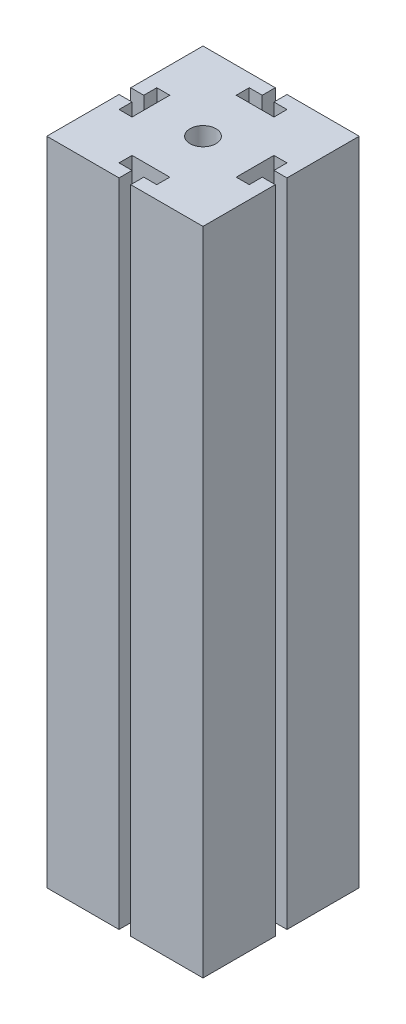
ISO-10303-21;
HEADER;
FILE_DESCRIPTION(('STEP AP214'),'2;1');
FILE_NAME('part.step','',(''),(''),'','','');
FILE_SCHEMA(('AUTOMOTIVE_DESIGN { 1 0 10303 214 1 1 1 1 }'));
ENDSEC;
DATA;
#1=APPLICATION_CONTEXT('core data for automotive mechanical design processes');
#2=APPLICATION_PROTOCOL_DEFINITION('international standard','automotive_design',2000,#1);
#3=PRODUCT_CONTEXT('',#1,'mechanical');
#4=PRODUCT('Part','Part','',(#3));
#5=PRODUCT_RELATED_PRODUCT_CATEGORY('part','',(#4));
#6=PRODUCT_DEFINITION_FORMATION('','',#4);
#7=PRODUCT_DEFINITION_CONTEXT('part definition',#1,'design');
#8=PRODUCT_DEFINITION('design','',#6,#7);
#9=PRODUCT_DEFINITION_SHAPE('','',#8);
#10=(LENGTH_UNIT() NAMED_UNIT(*) SI_UNIT(.MILLI.,.METRE.));
#11=(NAMED_UNIT(*) PLANE_ANGLE_UNIT() SI_UNIT($,.RADIAN.));
#12=(NAMED_UNIT(*) SI_UNIT($,.STERADIAN.) SOLID_ANGLE_UNIT());
#13=UNCERTAINTY_MEASURE_WITH_UNIT(LENGTH_MEASURE(1.E-05),#10,'distance_accuracy_value','');
#14=(GEOMETRIC_REPRESENTATION_CONTEXT(3) GLOBAL_UNCERTAINTY_ASSIGNED_CONTEXT((#13)) GLOBAL_UNIT_ASSIGNED_CONTEXT((#10,
#11,#12)) REPRESENTATION_CONTEXT('',''));
#15=CARTESIAN_POINT('',(0.,0.,0.));
#16=DIRECTION('',(0.,0.,1.));
#17=DIRECTION('',(1.,0.,0.));
#18=AXIS2_PLACEMENT_3D('',#15,#16,#17);
#19=CARTESIAN_POINT('',(-6.,50.,-6.));
#20=DIRECTION('',(1.,0.,0.));
#21=DIRECTION('',(0.,0.,-1.));
#22=AXIS2_PLACEMENT_3D('',#19,#20,#21);
#23=PLANE('',#22);
#24=DIRECTION('',(0.,0.,1.));
#25=VECTOR('',#24,1.);
#26=CARTESIAN_POINT('',(-6.,0.,-6.));
#27=LINE('',#26,#25);
#28=CARTESIAN_POINT('',(-6.,0.,-6.));
#29=VERTEX_POINT('',#28);
#30=CARTESIAN_POINT('',(-6.,0.,-0.45));
#31=VERTEX_POINT('',#30);
#32=EDGE_CURVE('E289',#29,#31,#27,.T.);
#33=ORIENTED_EDGE('',*,*,#32,.T.);
#34=DIRECTION('',(0.,1.,0.));
#35=VECTOR('',#34,1.);
#36=CARTESIAN_POINT('',(-6.,0.,-0.45));
#37=LINE('',#36,#35);
#38=CARTESIAN_POINT('',(-6.,50.,-0.45));
#39=VERTEX_POINT('',#38);
#40=EDGE_CURVE('E290',#31,#39,#37,.T.);
#41=ORIENTED_EDGE('',*,*,#40,.T.);
#42=DIRECTION('',(0.,0.,1.));
#43=VECTOR('',#42,1.);
#44=CARTESIAN_POINT('',(-6.,50.,-6.));
#45=LINE('',#44,#43);
#46=CARTESIAN_POINT('',(-6.,50.,-6.));
#47=VERTEX_POINT('',#46);
#48=EDGE_CURVE('E450',#47,#39,#45,.T.);
#49=ORIENTED_EDGE('',*,*,#48,.F.);
#50=DIRECTION('',(0.,-1.,0.));
#51=VECTOR('',#50,1.);
#52=CARTESIAN_POINT('',(-6.,50.,-6.));
#53=LINE('',#52,#51);
#54=EDGE_CURVE('E310',#47,#29,#53,.T.);
#55=ORIENTED_EDGE('',*,*,#54,.T.);
#56=EDGE_LOOP('',(#33,#41,#49,#55));
#57=FACE_BOUND('',#56,.T.);
#58=ADVANCED_FACE('F33',(#57),#23,.F.);
#59=CARTESIAN_POINT('',(-6.,50.,6.));
#60=DIRECTION('',(0.,0.,-1.));
#61=DIRECTION('',(-1.,0.,0.));
#62=AXIS2_PLACEMENT_3D('',#59,#60,#61);
#63=PLANE('',#62);
#64=DIRECTION('',(1.,0.,0.));
#65=VECTOR('',#64,1.);
#66=CARTESIAN_POINT('',(-6.,0.,6.));
#67=LINE('',#66,#65);
#68=CARTESIAN_POINT('',(-6.,0.,6.));
#69=VERTEX_POINT('',#68);
#70=CARTESIAN_POINT('',(-0.449999999999921,0.,5.99999999999997));
#71=VERTEX_POINT('',#70);
#72=EDGE_CURVE('E288',#69,#71,#67,.T.);
#73=ORIENTED_EDGE('',*,*,#72,.T.);
#74=DIRECTION('',(0.,1.,0.));
#75=VECTOR('',#74,1.);
#76=CARTESIAN_POINT('',(-0.449999999999921,0.,5.99999999999997));
#77=LINE('',#76,#75);
#78=CARTESIAN_POINT('',(-0.449999999999921,50.,5.99999999999997));
#79=VERTEX_POINT('',#78);
#80=EDGE_CURVE('E414',#71,#79,#77,.T.);
#81=ORIENTED_EDGE('',*,*,#80,.T.);
#82=DIRECTION('',(1.,0.,0.));
#83=VECTOR('',#82,1.);
#84=CARTESIAN_POINT('',(-6.,50.,6.));
#85=LINE('',#84,#83);
#86=CARTESIAN_POINT('',(-6.,50.,6.));
#87=VERTEX_POINT('',#86);
#88=EDGE_CURVE('E454',#87,#79,#85,.T.);
#89=ORIENTED_EDGE('',*,*,#88,.F.);
#90=DIRECTION('',(0.,-1.,0.));
#91=VECTOR('',#90,1.);
#92=CARTESIAN_POINT('',(-6.,50.,6.));
#93=LINE('',#92,#91);
#94=EDGE_CURVE('E11',#87,#69,#93,.T.);
#95=ORIENTED_EDGE('',*,*,#94,.T.);
#96=EDGE_LOOP('',(#73,#81,#89,#95));
#97=FACE_BOUND('',#96,.T.);
#98=ADVANCED_FACE('F624',(#97),#63,.F.);
#99=CARTESIAN_POINT('',(6.,50.,-6.));
#100=DIRECTION('',(-1.,0.,0.));
#101=DIRECTION('',(0.,0.,1.));
#102=AXIS2_PLACEMENT_3D('',#99,#100,#101);
#103=PLANE('',#102);
#104=DIRECTION('',(0.,0.,-1.));
#105=VECTOR('',#104,1.);
#106=CARTESIAN_POINT('',(6.,0.,-6.));
#107=LINE('',#106,#105);
#108=CARTESIAN_POINT('',(6.,0.,6.));
#109=VERTEX_POINT('',#108);
#110=CARTESIAN_POINT('',(6.00000000000004,0.,0.449999999999885));
#111=VERTEX_POINT('',#110);
#112=EDGE_CURVE('E303',#109,#111,#107,.T.);
#113=ORIENTED_EDGE('',*,*,#112,.T.);
#114=DIRECTION('',(0.,1.,0.));
#115=VECTOR('',#114,1.);
#116=CARTESIAN_POINT('',(6.00000000000004,0.,0.449999999999885));
#117=LINE('',#116,#115);
#118=CARTESIAN_POINT('',(6.00000000000004,50.,0.449999999999885));
#119=VERTEX_POINT('',#118);
#120=EDGE_CURVE('E360',#111,#119,#117,.T.);
#121=ORIENTED_EDGE('',*,*,#120,.T.);
#122=DIRECTION('',(0.,0.,-1.));
#123=VECTOR('',#122,1.);
#124=CARTESIAN_POINT('',(6.,50.,-6.));
#125=LINE('',#124,#123);
#126=CARTESIAN_POINT('',(6.,50.,6.));
#127=VERTEX_POINT('',#126);
#128=EDGE_CURVE('E323',#127,#119,#125,.T.);
#129=ORIENTED_EDGE('',*,*,#128,.F.);
#130=DIRECTION('',(0.,-1.,0.));
#131=VECTOR('',#130,1.);
#132=CARTESIAN_POINT('',(6.,50.,6.));
#133=LINE('',#132,#131);
#134=EDGE_CURVE('E41',#127,#109,#133,.T.);
#135=ORIENTED_EDGE('',*,*,#134,.T.);
#136=EDGE_LOOP('',(#113,#121,#129,#135));
#137=FACE_BOUND('',#136,.T.);
#138=ADVANCED_FACE('F320',(#137),#103,.F.);
#139=CARTESIAN_POINT('',(-6.,50.,-6.));
#140=DIRECTION('',(0.,0.,1.));
#141=DIRECTION('',(1.,0.,0.));
#142=AXIS2_PLACEMENT_3D('',#139,#140,#141);
#143=PLANE('',#142);
#144=DIRECTION('',(-1.,0.,0.));
#145=VECTOR('',#144,1.);
#146=CARTESIAN_POINT('',(-6.,0.,-6.));
#147=LINE('',#146,#145);
#148=CARTESIAN_POINT('',(6.,0.,-6.));
#149=VERTEX_POINT('',#148);
#150=CARTESIAN_POINT('',(0.450000000000021,0.,-6.));
#151=VERTEX_POINT('',#150);
#152=EDGE_CURVE('E307',#149,#151,#147,.T.);
#153=ORIENTED_EDGE('',*,*,#152,.T.);
#154=DIRECTION('',(0.,1.,0.));
#155=VECTOR('',#154,1.);
#156=CARTESIAN_POINT('',(0.450000000000021,0.,-6.));
#157=LINE('',#156,#155);
#158=CARTESIAN_POINT('',(0.450000000000021,50.,-6.));
#159=VERTEX_POINT('',#158);
#160=EDGE_CURVE('E346',#151,#159,#157,.T.);
#161=ORIENTED_EDGE('',*,*,#160,.T.);
#162=DIRECTION('',(-1.,0.,0.));
#163=VECTOR('',#162,1.);
#164=CARTESIAN_POINT('',(-6.,50.,-6.));
#165=LINE('',#164,#163);
#166=CARTESIAN_POINT('',(6.,50.,-6.));
#167=VERTEX_POINT('',#166);
#168=EDGE_CURVE('E299',#167,#159,#165,.T.);
#169=ORIENTED_EDGE('',*,*,#168,.F.);
#170=DIRECTION('',(0.,-1.,0.));
#171=VECTOR('',#170,1.);
#172=CARTESIAN_POINT('',(6.,50.,-6.));
#173=LINE('',#172,#171);
#174=EDGE_CURVE('E313',#167,#149,#173,.T.);
#175=ORIENTED_EDGE('',*,*,#174,.T.);
#176=EDGE_LOOP('',(#153,#161,#169,#175));
#177=FACE_BOUND('',#176,.T.);
#178=ADVANCED_FACE('F476',(#177),#143,.F.);
#179=CARTESIAN_POINT('',(-6.,50.,0.45));
#180=VERTEX_POINT('',#179);
#181=EDGE_CURVE('E281',#180,#87,#45,.T.);
#182=ORIENTED_EDGE('',*,*,#181,.F.);
#183=DIRECTION('',(0.,1.,0.));
#184=VECTOR('',#183,1.);
#185=CARTESIAN_POINT('',(-6.,0.,0.45));
#186=LINE('',#185,#184);
#187=CARTESIAN_POINT('',(-6.,0.,0.45));
#188=VERTEX_POINT('',#187);
#189=EDGE_CURVE('E269',#188,#180,#186,.T.);
#190=ORIENTED_EDGE('',*,*,#189,.F.);
#191=EDGE_CURVE('E279',#188,#69,#27,.T.);
#192=ORIENTED_EDGE('',*,*,#191,.T.);
#193=ORIENTED_EDGE('',*,*,#94,.F.);
#194=EDGE_LOOP('',(#182,#190,#192,#193));
#195=FACE_BOUND('',#194,.T.);
#196=ADVANCED_FACE('F35',(#195),#23,.F.);
#197=CARTESIAN_POINT('',(0.450000000000079,50.,5.99999999999996));
#198=VERTEX_POINT('',#197);
#199=EDGE_CURVE('E453',#198,#127,#85,.T.);
#200=ORIENTED_EDGE('',*,*,#199,.F.);
#201=DIRECTION('',(0.,1.,0.));
#202=VECTOR('',#201,1.);
#203=CARTESIAN_POINT('',(0.450000000000079,0.,5.99999999999996));
#204=LINE('',#203,#202);
#205=CARTESIAN_POINT('',(0.450000000000079,0.,5.99999999999996));
#206=VERTEX_POINT('',#205);
#207=EDGE_CURVE('E446',#206,#198,#204,.T.);
#208=ORIENTED_EDGE('',*,*,#207,.F.);
#209=EDGE_CURVE('E293',#206,#109,#67,.T.);
#210=ORIENTED_EDGE('',*,*,#209,.T.);
#211=ORIENTED_EDGE('',*,*,#134,.F.);
#212=EDGE_LOOP('',(#200,#208,#210,#211));
#213=FACE_BOUND('',#212,.T.);
#214=ADVANCED_FACE('F630',(#213),#63,.F.);
#215=CARTESIAN_POINT('',(6.00000000000004,50.,-0.450000000000115));
#216=VERTEX_POINT('',#215);
#217=EDGE_CURVE('E456',#216,#167,#125,.T.);
#218=ORIENTED_EDGE('',*,*,#217,.F.);
#219=DIRECTION('',(0.,1.,0.));
#220=VECTOR('',#219,1.);
#221=CARTESIAN_POINT('',(6.00000000000004,0.,-0.450000000000115));
#222=LINE('',#221,#220);
#223=CARTESIAN_POINT('',(6.00000000000004,0.,-0.450000000000115));
#224=VERTEX_POINT('',#223);
#225=EDGE_CURVE('E391',#224,#216,#222,.T.);
#226=ORIENTED_EDGE('',*,*,#225,.F.);
#227=EDGE_CURVE('E302',#224,#149,#107,.T.);
#228=ORIENTED_EDGE('',*,*,#227,.T.);
#229=ORIENTED_EDGE('',*,*,#174,.F.);
#230=EDGE_LOOP('',(#218,#226,#228,#229));
#231=FACE_BOUND('',#230,.T.);
#232=ADVANCED_FACE('F471',(#231),#103,.F.);
#233=CARTESIAN_POINT('',(-0.449999999999979,50.,-6.));
#234=VERTEX_POINT('',#233);
#235=EDGE_CURVE('E457',#234,#47,#165,.T.);
#236=ORIENTED_EDGE('',*,*,#235,.F.);
#237=DIRECTION('',(0.,1.,0.));
#238=VECTOR('',#237,1.);
#239=CARTESIAN_POINT('',(-0.449999999999979,0.,-6.));
#240=LINE('',#239,#238);
#241=CARTESIAN_POINT('',(-0.449999999999979,0.,-6.));
#242=VERTEX_POINT('',#241);
#243=EDGE_CURVE('E480',#242,#234,#240,.T.);
#244=ORIENTED_EDGE('',*,*,#243,.F.);
#245=EDGE_CURVE('E306',#242,#29,#147,.T.);
#246=ORIENTED_EDGE('',*,*,#245,.T.);
#247=ORIENTED_EDGE('',*,*,#54,.F.);
#248=EDGE_LOOP('',(#236,#244,#246,#247));
#249=FACE_BOUND('',#248,.T.);
#250=ADVANCED_FACE('F612',(#249),#143,.F.);
#251=CARTESIAN_POINT('',(0.,50.,0.));
#252=DIRECTION('',(0.,1.,0.));
#253=DIRECTION('',(0.,0.,1.));
#254=AXIS2_PLACEMENT_3D('',#251,#252,#253);
#255=PLANE('',#254);
#256=CARTESIAN_POINT('',(0.,50.,0.));
#257=DIRECTION('',(0.,1.,0.));
#258=DIRECTION('',(0.,0.,1.));
#259=AXIS2_PLACEMENT_3D('',#256,#257,#258);
#260=CIRCLE('',#259,1.);
#261=CARTESIAN_POINT('',(0.,50.,1.));
#262=VERTEX_POINT('',#261);
#263=EDGE_CURVE('E598',#262,#262,#260,.T.);
#264=ORIENTED_EDGE('',*,*,#263,.F.);
#265=EDGE_LOOP('',(#264));
#266=FACE_BOUND('',#265,.T.);
#267=DIRECTION('',(-1.,0.,0.));
#268=VECTOR('',#267,1.);
#269=CARTESIAN_POINT('',(-6.,50.,-0.45));
#270=LINE('',#269,#268);
#271=CARTESIAN_POINT('',(-5.,50.,-0.45));
#272=VERTEX_POINT('',#271);
#273=EDGE_CURVE('E274',#272,#39,#270,.T.);
#274=ORIENTED_EDGE('',*,*,#273,.F.);
#275=DIRECTION('',(0.,0.,1.));
#276=VECTOR('',#275,1.);
#277=CARTESIAN_POINT('',(-5.,50.,-1.45));
#278=LINE('',#277,#276);
#279=CARTESIAN_POINT('',(-5.,50.,-1.45));
#280=VERTEX_POINT('',#279);
#281=EDGE_CURVE('E568',#280,#272,#278,.T.);
#282=ORIENTED_EDGE('',*,*,#281,.F.);
#283=DIRECTION('',(-1.,0.,0.));
#284=VECTOR('',#283,1.);
#285=CARTESIAN_POINT('',(-5.,50.,-1.45));
#286=LINE('',#285,#284);
#287=CARTESIAN_POINT('',(-4.,50.,-1.45));
#288=VERTEX_POINT('',#287);
#289=EDGE_CURVE('E571',#288,#280,#286,.T.);
#290=ORIENTED_EDGE('',*,*,#289,.F.);
#291=DIRECTION('',(0.,0.,-1.));
#292=VECTOR('',#291,1.);
#293=CARTESIAN_POINT('',(-4.,50.,-1.45));
#294=LINE('',#293,#292);
#295=CARTESIAN_POINT('',(-4.,50.,1.45));
#296=VERTEX_POINT('',#295);
#297=EDGE_CURVE('E574',#296,#288,#294,.T.);
#298=ORIENTED_EDGE('',*,*,#297,.F.);
#299=DIRECTION('',(1.,0.,0.));
#300=VECTOR('',#299,1.);
#301=CARTESIAN_POINT('',(-5.,50.,1.45));
#302=LINE('',#301,#300);
#303=CARTESIAN_POINT('',(-5.,50.,1.45));
#304=VERTEX_POINT('',#303);
#305=EDGE_CURVE('E577',#304,#296,#302,.T.);
#306=ORIENTED_EDGE('',*,*,#305,.F.);
#307=DIRECTION('',(0.,0.,1.));
#308=VECTOR('',#307,1.);
#309=CARTESIAN_POINT('',(-5.,50.,0.45));
#310=LINE('',#309,#308);
#311=CARTESIAN_POINT('',(-5.,50.,0.45));
#312=VERTEX_POINT('',#311);
#313=EDGE_CURVE('E580',#312,#304,#310,.T.);
#314=ORIENTED_EDGE('',*,*,#313,.F.);
#315=DIRECTION('',(1.,0.,0.));
#316=VECTOR('',#315,1.);
#317=CARTESIAN_POINT('',(-6.,50.,0.45));
#318=LINE('',#317,#316);
#319=EDGE_CURVE('E514',#180,#312,#318,.T.);
#320=ORIENTED_EDGE('',*,*,#319,.F.);
#321=ORIENTED_EDGE('',*,*,#181,.T.);
#322=ORIENTED_EDGE('',*,*,#88,.T.);
#323=DIRECTION('',(0.,0.,1.));
#324=VECTOR('',#323,1.);
#325=CARTESIAN_POINT('',(-0.449999999999921,50.,5.99999999999997));
#326=LINE('',#325,#324);
#327=CARTESIAN_POINT('',(-0.449999999999921,50.,4.99999999999996));
#328=VERTEX_POINT('',#327);
#329=EDGE_CURVE('E415',#328,#79,#326,.T.);
#330=ORIENTED_EDGE('',*,*,#329,.F.);
#331=DIRECTION('',(1.,0.,0.));
#332=VECTOR('',#331,1.);
#333=CARTESIAN_POINT('',(-1.45000000000005,50.,4.99999999999998));
#334=LINE('',#333,#332);
#335=CARTESIAN_POINT('',(-1.45000000000005,50.,4.99999999999998));
#336=VERTEX_POINT('',#335);
#337=EDGE_CURVE('E397',#336,#328,#334,.T.);
#338=ORIENTED_EDGE('',*,*,#337,.F.);
#339=DIRECTION('',(0.,0.,1.));
#340=VECTOR('',#339,1.);
#341=CARTESIAN_POINT('',(-1.45000000000005,50.,4.99999999999998));
#342=LINE('',#341,#340);
#343=CARTESIAN_POINT('',(-1.45000000000004,50.,3.99999999999998));
#344=VERTEX_POINT('',#343);
#345=EDGE_CURVE('E430',#344,#336,#342,.T.);
#346=ORIENTED_EDGE('',*,*,#345,.F.);
#347=DIRECTION('',(-1.,0.,0.));
#348=VECTOR('',#347,1.);
#349=CARTESIAN_POINT('',(-1.45000000000004,50.,3.99999999999998));
#350=LINE('',#349,#348);
#351=CARTESIAN_POINT('',(1.44999999999996,50.,4.00000000000002));
#352=VERTEX_POINT('',#351);
#353=EDGE_CURVE('E427',#352,#344,#350,.T.);
#354=ORIENTED_EDGE('',*,*,#353,.F.);
#355=DIRECTION('',(-1.19695919842406E-13,0.,-1.));
#356=VECTOR('',#355,1.);
#357=CARTESIAN_POINT('',(1.45000000000008,50.,4.99999999999997));
#358=LINE('',#357,#356);
#359=CARTESIAN_POINT('',(1.45000000000008,50.,4.99999999999997));
#360=VERTEX_POINT('',#359);
#361=EDGE_CURVE('E424',#360,#352,#358,.T.);
#362=ORIENTED_EDGE('',*,*,#361,.F.);
#363=DIRECTION('',(1.,0.,0.));
#364=VECTOR('',#363,1.);
#365=CARTESIAN_POINT('',(0.450000000000079,50.,4.99999999999996));
#366=LINE('',#365,#364);
#367=CARTESIAN_POINT('',(0.450000000000079,50.,4.99999999999996));
#368=VERTEX_POINT('',#367);
#369=EDGE_CURVE('E421',#368,#360,#366,.T.);
#370=ORIENTED_EDGE('',*,*,#369,.F.);
#371=DIRECTION('',(0.,0.,-1.));
#372=VECTOR('',#371,1.);
#373=CARTESIAN_POINT('',(0.450000000000079,50.,5.99999999999996));
#374=LINE('',#373,#372);
#375=EDGE_CURVE('E417',#198,#368,#374,.T.);
#376=ORIENTED_EDGE('',*,*,#375,.F.);
#377=ORIENTED_EDGE('',*,*,#199,.T.);
#378=ORIENTED_EDGE('',*,*,#128,.T.);
#379=DIRECTION('',(1.,0.,0.));
#380=VECTOR('',#379,1.);
#381=CARTESIAN_POINT('',(6.00000000000004,50.,0.449999999999885));
#382=LINE('',#381,#380);
#383=CARTESIAN_POINT('',(5.00000000000004,50.,0.449999999999885));
#384=VERTEX_POINT('',#383);
#385=EDGE_CURVE('E361',#384,#119,#382,.T.);
#386=ORIENTED_EDGE('',*,*,#385,.F.);
#387=DIRECTION('',(0.,0.,-1.));
#388=VECTOR('',#387,1.);
#389=CARTESIAN_POINT('',(5.00000000000004,50.,1.44999999999989));
#390=LINE('',#389,#388);
#391=CARTESIAN_POINT('',(5.00000000000004,50.,1.44999999999989));
#392=VERTEX_POINT('',#391);
#393=EDGE_CURVE('E337',#392,#384,#390,.T.);
#394=ORIENTED_EDGE('',*,*,#393,.F.);
#395=DIRECTION('',(1.,0.,0.));
#396=VECTOR('',#395,1.);
#397=CARTESIAN_POINT('',(5.00000000000004,50.,1.44999999999989));
#398=LINE('',#397,#396);
#399=CARTESIAN_POINT('',(4.00000000000004,50.,1.44999999999989));
#400=VERTEX_POINT('',#399);
#401=EDGE_CURVE('E343',#400,#392,#398,.T.);
#402=ORIENTED_EDGE('',*,*,#401,.F.);
#403=DIRECTION('',(0.,0.,1.));
#404=VECTOR('',#403,1.);
#405=CARTESIAN_POINT('',(4.00000000000004,50.,1.44999999999989));
#406=LINE('',#405,#404);
#407=CARTESIAN_POINT('',(4.00000000000004,50.,-1.45000000000011));
#408=VERTEX_POINT('',#407);
#409=EDGE_CURVE('E373',#408,#400,#406,.T.);
#410=ORIENTED_EDGE('',*,*,#409,.F.);
#411=DIRECTION('',(-1.,0.,0.));
#412=VECTOR('',#411,1.);
#413=CARTESIAN_POINT('',(5.00000000000004,50.,-1.45000000000011));
#414=LINE('',#413,#412);
#415=CARTESIAN_POINT('',(5.00000000000004,50.,-1.45000000000011));
#416=VERTEX_POINT('',#415);
#417=EDGE_CURVE('E370',#416,#408,#414,.T.);
#418=ORIENTED_EDGE('',*,*,#417,.F.);
#419=DIRECTION('',(0.,0.,-1.));
#420=VECTOR('',#419,1.);
#421=CARTESIAN_POINT('',(5.00000000000004,50.,-0.450000000000115));
#422=LINE('',#421,#420);
#423=CARTESIAN_POINT('',(5.00000000000004,50.,-0.450000000000115));
#424=VERTEX_POINT('',#423);
#425=EDGE_CURVE('E367',#424,#416,#422,.T.);
#426=ORIENTED_EDGE('',*,*,#425,.F.);
#427=DIRECTION('',(-1.,0.,0.));
#428=VECTOR('',#427,1.);
#429=CARTESIAN_POINT('',(6.00000000000004,50.,-0.450000000000115));
#430=LINE('',#429,#428);
#431=EDGE_CURVE('E363',#216,#424,#430,.T.);
#432=ORIENTED_EDGE('',*,*,#431,.F.);
#433=ORIENTED_EDGE('',*,*,#217,.T.);
#434=ORIENTED_EDGE('',*,*,#168,.T.);
#435=DIRECTION('',(0.,0.,-1.));
#436=VECTOR('',#435,1.);
#437=CARTESIAN_POINT('',(0.450000000000021,50.,-6.));
#438=LINE('',#437,#436);
#439=CARTESIAN_POINT('',(0.450000000000017,50.,-5.));
#440=VERTEX_POINT('',#439);
#441=EDGE_CURVE('E380',#440,#159,#438,.T.);
#442=ORIENTED_EDGE('',*,*,#441,.F.);
#443=DIRECTION('',(-1.,0.,0.));
#444=VECTOR('',#443,1.);
#445=CARTESIAN_POINT('',(1.45000000000002,50.,-4.99999999999999));
#446=LINE('',#445,#444);
#447=CARTESIAN_POINT('',(1.45000000000002,50.,-4.99999999999999));
#448=VERTEX_POINT('',#447);
#449=EDGE_CURVE('E508',#448,#440,#446,.T.);
#450=ORIENTED_EDGE('',*,*,#449,.F.);
#451=DIRECTION('',(0.,0.,-1.));
#452=VECTOR('',#451,1.);
#453=CARTESIAN_POINT('',(1.45000000000002,50.,-4.99999999999999));
#454=LINE('',#453,#452);
#455=CARTESIAN_POINT('',(1.45000000000001,50.,-4.));
#456=VERTEX_POINT('',#455);
#457=EDGE_CURVE('E505',#456,#448,#454,.T.);
#458=ORIENTED_EDGE('',*,*,#457,.F.);
#459=DIRECTION('',(1.,0.,0.));
#460=VECTOR('',#459,1.);
#461=CARTESIAN_POINT('',(1.45000000000001,50.,-4.));
#462=LINE('',#461,#460);
#463=CARTESIAN_POINT('',(-1.44999999999999,50.,-4.00000000000001));
#464=VERTEX_POINT('',#463);
#465=EDGE_CURVE('E502',#464,#456,#462,.T.);
#466=ORIENTED_EDGE('',*,*,#465,.F.);
#467=DIRECTION('',(0.,0.,1.));
#468=VECTOR('',#467,1.);
#469=CARTESIAN_POINT('',(-1.44999999999998,50.,-5.00000000000001));
#470=LINE('',#469,#468);
#471=CARTESIAN_POINT('',(-1.44999999999998,50.,-5.00000000000001));
#472=VERTEX_POINT('',#471);
#473=EDGE_CURVE('E499',#472,#464,#470,.T.);
#474=ORIENTED_EDGE('',*,*,#473,.F.);
#475=DIRECTION('',(-1.,0.,0.));
#476=VECTOR('',#475,1.);
#477=CARTESIAN_POINT('',(-0.449999999999983,50.,-5.));
#478=LINE('',#477,#476);
#479=CARTESIAN_POINT('',(-0.449999999999983,50.,-5.));
#480=VERTEX_POINT('',#479);
#481=EDGE_CURVE('E496',#480,#472,#478,.T.);
#482=ORIENTED_EDGE('',*,*,#481,.F.);
#483=DIRECTION('',(0.,0.,1.));
#484=VECTOR('',#483,1.);
#485=CARTESIAN_POINT('',(-0.449999999999979,50.,-6.));
#486=LINE('',#485,#484);
#487=EDGE_CURVE('E493',#234,#480,#486,.T.);
#488=ORIENTED_EDGE('',*,*,#487,.F.);
#489=ORIENTED_EDGE('',*,*,#235,.T.);
#490=ORIENTED_EDGE('',*,*,#48,.T.);
#491=EDGE_LOOP('',(#274,#282,#290,#298,#306,#314,#320,#321,#322,#330,#338,#346,#354,#362,#370,
#376,#377,#378,#386,#394,#402,#410,#418,#426,#432,#433,#434,#442,#450,#458,#466,#474,#482,#488,
#489,#490));
#492=FACE_BOUND('',#491,.T.);
#493=ADVANCED_FACE('F465',(#266,#492),#255,.T.);
#494=CARTESIAN_POINT('',(0.,0.,0.));
#495=DIRECTION('',(0.,1.,0.));
#496=DIRECTION('',(0.,0.,1.));
#497=AXIS2_PLACEMENT_3D('',#494,#495,#496);
#498=PLANE('',#497);
#499=CARTESIAN_POINT('',(0.,0.,0.));
#500=DIRECTION('',(0.,1.,0.));
#501=DIRECTION('',(0.,0.,1.));
#502=AXIS2_PLACEMENT_3D('',#499,#500,#501);
#503=CIRCLE('',#502,1.);
#504=CARTESIAN_POINT('',(0.,0.,1.));
#505=VERTEX_POINT('',#504);
#506=EDGE_CURVE('E418',#505,#505,#503,.T.);
#507=ORIENTED_EDGE('',*,*,#506,.T.);
#508=EDGE_LOOP('',(#507));
#509=FACE_BOUND('',#508,.T.);
#510=DIRECTION('',(0.,0.,1.));
#511=VECTOR('',#510,1.);
#512=CARTESIAN_POINT('',(-5.,0.,-1.45));
#513=LINE('',#512,#511);
#514=CARTESIAN_POINT('',(-5.,0.,-1.45));
#515=VERTEX_POINT('',#514);
#516=CARTESIAN_POINT('',(-5.,0.,-0.45));
#517=VERTEX_POINT('',#516);
#518=EDGE_CURVE('E586',#515,#517,#513,.T.);
#519=ORIENTED_EDGE('',*,*,#518,.T.);
#520=DIRECTION('',(-1.,0.,0.));
#521=VECTOR('',#520,1.);
#522=CARTESIAN_POINT('',(-6.,0.,-0.45));
#523=LINE('',#522,#521);
#524=EDGE_CURVE('E282',#517,#31,#523,.T.);
#525=ORIENTED_EDGE('',*,*,#524,.T.);
#526=ORIENTED_EDGE('',*,*,#32,.F.);
#527=ORIENTED_EDGE('',*,*,#245,.F.);
#528=DIRECTION('',(0.,0.,1.));
#529=VECTOR('',#528,1.);
#530=CARTESIAN_POINT('',(-0.449999999999979,0.,-6.));
#531=LINE('',#530,#529);
#532=CARTESIAN_POINT('',(-0.449999999999983,0.,-5.));
#533=VERTEX_POINT('',#532);
#534=EDGE_CURVE('E543',#242,#533,#531,.T.);
#535=ORIENTED_EDGE('',*,*,#534,.T.);
#536=DIRECTION('',(-1.,0.,0.));
#537=VECTOR('',#536,1.);
#538=CARTESIAN_POINT('',(-0.449999999999983,0.,-5.));
#539=LINE('',#538,#537);
#540=CARTESIAN_POINT('',(-1.44999999999998,0.,-5.00000000000001));
#541=VERTEX_POINT('',#540);
#542=EDGE_CURVE('E56',#533,#541,#539,.T.);
#543=ORIENTED_EDGE('',*,*,#542,.T.);
#544=DIRECTION('',(0.,0.,1.));
#545=VECTOR('',#544,1.);
#546=CARTESIAN_POINT('',(-1.44999999999998,0.,-5.00000000000001));
#547=LINE('',#546,#545);
#548=CARTESIAN_POINT('',(-1.44999999999999,0.,-4.00000000000001));
#549=VERTEX_POINT('',#548);
#550=EDGE_CURVE('E539',#541,#549,#547,.T.);
#551=ORIENTED_EDGE('',*,*,#550,.T.);
#552=DIRECTION('',(1.,0.,0.));
#553=VECTOR('',#552,1.);
#554=CARTESIAN_POINT('',(1.45000000000001,0.,-4.));
#555=LINE('',#554,#553);
#556=CARTESIAN_POINT('',(1.45000000000001,0.,-4.));
#557=VERTEX_POINT('',#556);
#558=EDGE_CURVE('E488',#549,#557,#555,.T.);
#559=ORIENTED_EDGE('',*,*,#558,.T.);
#560=DIRECTION('',(0.,0.,-1.));
#561=VECTOR('',#560,1.);
#562=CARTESIAN_POINT('',(1.45000000000002,0.,-4.99999999999999));
#563=LINE('',#562,#561);
#564=CARTESIAN_POINT('',(1.45000000000002,0.,-4.99999999999999));
#565=VERTEX_POINT('',#564);
#566=EDGE_CURVE('E484',#557,#565,#563,.T.);
#567=ORIENTED_EDGE('',*,*,#566,.T.);
#568=DIRECTION('',(-1.,0.,0.));
#569=VECTOR('',#568,1.);
#570=CARTESIAN_POINT('',(1.45000000000002,0.,-4.99999999999999));
#571=LINE('',#570,#569);
#572=CARTESIAN_POINT('',(0.450000000000017,0.,-5.));
#573=VERTEX_POINT('',#572);
#574=EDGE_CURVE('E481',#565,#573,#571,.T.);
#575=ORIENTED_EDGE('',*,*,#574,.T.);
#576=DIRECTION('',(0.,0.,-1.));
#577=VECTOR('',#576,1.);
#578=CARTESIAN_POINT('',(0.450000000000021,0.,-6.));
#579=LINE('',#578,#577);
#580=EDGE_CURVE('E511',#573,#151,#579,.T.);
#581=ORIENTED_EDGE('',*,*,#580,.T.);
#582=ORIENTED_EDGE('',*,*,#152,.F.);
#583=ORIENTED_EDGE('',*,*,#227,.F.);
#584=DIRECTION('',(-1.,0.,0.));
#585=VECTOR('',#584,1.);
#586=CARTESIAN_POINT('',(6.00000000000004,0.,-0.450000000000115));
#587=LINE('',#586,#585);
#588=CARTESIAN_POINT('',(5.00000000000004,0.,-0.450000000000115));
#589=VERTEX_POINT('',#588);
#590=EDGE_CURVE('E336',#224,#589,#587,.T.);
#591=ORIENTED_EDGE('',*,*,#590,.T.);
#592=DIRECTION('',(0.,0.,-1.));
#593=VECTOR('',#592,1.);
#594=CARTESIAN_POINT('',(5.00000000000004,0.,-0.450000000000115));
#595=LINE('',#594,#593);
#596=CARTESIAN_POINT('',(5.00000000000004,0.,-1.45000000000011));
#597=VERTEX_POINT('',#596);
#598=EDGE_CURVE('E340',#589,#597,#595,.T.);
#599=ORIENTED_EDGE('',*,*,#598,.T.);
#600=DIRECTION('',(-1.,0.,0.));
#601=VECTOR('',#600,1.);
#602=CARTESIAN_POINT('',(5.00000000000004,0.,-1.45000000000011));
#603=LINE('',#602,#601);
#604=CARTESIAN_POINT('',(4.00000000000004,0.,-1.45000000000011));
#605=VERTEX_POINT('',#604);
#606=EDGE_CURVE('E351',#597,#605,#603,.T.);
#607=ORIENTED_EDGE('',*,*,#606,.T.);
#608=DIRECTION('',(0.,0.,1.));
#609=VECTOR('',#608,1.);
#610=CARTESIAN_POINT('',(4.00000000000004,0.,1.44999999999989));
#611=LINE('',#610,#609);
#612=CARTESIAN_POINT('',(4.00000000000004,0.,1.44999999999989));
#613=VERTEX_POINT('',#612);
#614=EDGE_CURVE('E354',#605,#613,#611,.T.);
#615=ORIENTED_EDGE('',*,*,#614,.T.);
#616=DIRECTION('',(1.,0.,0.));
#617=VECTOR('',#616,1.);
#618=CARTESIAN_POINT('',(5.00000000000004,0.,1.44999999999989));
#619=LINE('',#618,#617);
#620=CARTESIAN_POINT('',(5.00000000000004,0.,1.44999999999989));
#621=VERTEX_POINT('',#620);
#622=EDGE_CURVE('E357',#613,#621,#619,.T.);
#623=ORIENTED_EDGE('',*,*,#622,.T.);
#624=DIRECTION('',(0.,0.,-1.));
#625=VECTOR('',#624,1.);
#626=CARTESIAN_POINT('',(5.00000000000004,0.,1.44999999999989));
#627=LINE('',#626,#625);
#628=CARTESIAN_POINT('',(5.00000000000004,0.,0.449999999999885));
#629=VERTEX_POINT('',#628);
#630=EDGE_CURVE('E334',#621,#629,#627,.T.);
#631=ORIENTED_EDGE('',*,*,#630,.T.);
#632=DIRECTION('',(1.,0.,0.));
#633=VECTOR('',#632,1.);
#634=CARTESIAN_POINT('',(6.00000000000004,0.,0.449999999999885));
#635=LINE('',#634,#633);
#636=EDGE_CURVE('E331',#629,#111,#635,.T.);
#637=ORIENTED_EDGE('',*,*,#636,.T.);
#638=ORIENTED_EDGE('',*,*,#112,.F.);
#639=ORIENTED_EDGE('',*,*,#209,.F.);
#640=DIRECTION('',(0.,0.,-1.));
#641=VECTOR('',#640,1.);
#642=CARTESIAN_POINT('',(0.450000000000079,0.,5.99999999999996));
#643=LINE('',#642,#641);
#644=CARTESIAN_POINT('',(0.450000000000079,0.,4.99999999999996));
#645=VERTEX_POINT('',#644);
#646=EDGE_CURVE('E396',#206,#645,#643,.T.);
#647=ORIENTED_EDGE('',*,*,#646,.T.);
#648=DIRECTION('',(1.,0.,0.));
#649=VECTOR('',#648,1.);
#650=CARTESIAN_POINT('',(0.450000000000079,0.,4.99999999999996));
#651=LINE('',#650,#649);
#652=CARTESIAN_POINT('',(1.45000000000008,0.,4.99999999999997));
#653=VERTEX_POINT('',#652);
#654=EDGE_CURVE('E399',#645,#653,#651,.T.);
#655=ORIENTED_EDGE('',*,*,#654,.T.);
#656=DIRECTION('',(-1.19695919842406E-13,0.,-1.));
#657=VECTOR('',#656,1.);
#658=CARTESIAN_POINT('',(1.45000000000008,0.,4.99999999999997));
#659=LINE('',#658,#657);
#660=CARTESIAN_POINT('',(1.44999999999996,0.,4.00000000000002));
#661=VERTEX_POINT('',#660);
#662=EDGE_CURVE('E402',#653,#661,#659,.T.);
#663=ORIENTED_EDGE('',*,*,#662,.T.);
#664=DIRECTION('',(-1.,0.,0.));
#665=VECTOR('',#664,1.);
#666=CARTESIAN_POINT('',(-1.45000000000004,0.,3.99999999999998));
#667=LINE('',#666,#665);
#668=CARTESIAN_POINT('',(-1.45000000000004,0.,3.99999999999998));
#669=VERTEX_POINT('',#668);
#670=EDGE_CURVE('E405',#661,#669,#667,.T.);
#671=ORIENTED_EDGE('',*,*,#670,.T.);
#672=DIRECTION('',(0.,0.,1.));
#673=VECTOR('',#672,1.);
#674=CARTESIAN_POINT('',(-1.45000000000005,0.,4.99999999999998));
#675=LINE('',#674,#673);
#676=CARTESIAN_POINT('',(-1.45000000000005,0.,4.99999999999998));
#677=VERTEX_POINT('',#676);
#678=EDGE_CURVE('E408',#669,#677,#675,.T.);
#679=ORIENTED_EDGE('',*,*,#678,.T.);
#680=DIRECTION('',(1.,0.,0.));
#681=VECTOR('',#680,1.);
#682=CARTESIAN_POINT('',(-1.45000000000005,0.,4.99999999999998));
#683=LINE('',#682,#681);
#684=CARTESIAN_POINT('',(-0.449999999999921,0.,4.99999999999996));
#685=VERTEX_POINT('',#684);
#686=EDGE_CURVE('E411',#677,#685,#683,.T.);
#687=ORIENTED_EDGE('',*,*,#686,.T.);
#688=DIRECTION('',(0.,0.,1.));
#689=VECTOR('',#688,1.);
#690=CARTESIAN_POINT('',(-0.449999999999921,0.,5.99999999999997));
#691=LINE('',#690,#689);
#692=EDGE_CURVE('E394',#685,#71,#691,.T.);
#693=ORIENTED_EDGE('',*,*,#692,.T.);
#694=ORIENTED_EDGE('',*,*,#72,.F.);
#695=ORIENTED_EDGE('',*,*,#191,.F.);
#696=DIRECTION('',(1.,0.,0.));
#697=VECTOR('',#696,1.);
#698=CARTESIAN_POINT('',(-6.,0.,0.45));
#699=LINE('',#698,#697);
#700=CARTESIAN_POINT('',(-5.,0.,0.45));
#701=VERTEX_POINT('',#700);
#702=EDGE_CURVE('E265',#188,#701,#699,.T.);
#703=ORIENTED_EDGE('',*,*,#702,.T.);
#704=DIRECTION('',(0.,0.,1.));
#705=VECTOR('',#704,1.);
#706=CARTESIAN_POINT('',(-5.,0.,0.45));
#707=LINE('',#706,#705);
#708=CARTESIAN_POINT('',(-5.,0.,1.45));
#709=VERTEX_POINT('',#708);
#710=EDGE_CURVE('E48',#701,#709,#707,.T.);
#711=ORIENTED_EDGE('',*,*,#710,.T.);
#712=DIRECTION('',(1.,0.,0.));
#713=VECTOR('',#712,1.);
#714=CARTESIAN_POINT('',(-5.,0.,1.45));
#715=LINE('',#714,#713);
#716=CARTESIAN_POINT('',(-4.,0.,1.45));
#717=VERTEX_POINT('',#716);
#718=EDGE_CURVE('E594',#709,#717,#715,.T.);
#719=ORIENTED_EDGE('',*,*,#718,.T.);
#720=DIRECTION('',(0.,0.,-1.));
#721=VECTOR('',#720,1.);
#722=CARTESIAN_POINT('',(-4.,0.,-1.45));
#723=LINE('',#722,#721);
#724=CARTESIAN_POINT('',(-4.,0.,-1.45));
#725=VERTEX_POINT('',#724);
#726=EDGE_CURVE('E591',#717,#725,#723,.T.);
#727=ORIENTED_EDGE('',*,*,#726,.T.);
#728=DIRECTION('',(-1.,0.,0.));
#729=VECTOR('',#728,1.);
#730=CARTESIAN_POINT('',(-5.,0.,-1.45));
#731=LINE('',#730,#729);
#732=EDGE_CURVE('E588',#725,#515,#731,.T.);
#733=ORIENTED_EDGE('',*,*,#732,.T.);
#734=EDGE_LOOP('',(#519,#525,#526,#527,#535,#543,#551,#559,#567,#575,#581,#582,#583,#591,#599,
#607,#615,#623,#631,#637,#638,#639,#647,#655,#663,#671,#679,#687,#693,#694,#695,#703,#711,#719,
#727,#733));
#735=FACE_BOUND('',#734,.T.);
#736=ADVANCED_FACE('F285',(#509,#735),#498,.F.);
#737=CARTESIAN_POINT('',(-0.449999999999921,0.,5.99999999999997));
#738=DIRECTION('',(-1.,0.,0.));
#739=DIRECTION('',(0.,0.,1.));
#740=AXIS2_PLACEMENT_3D('',#737,#738,#739);
#741=PLANE('',#740);
#742=ORIENTED_EDGE('',*,*,#329,.T.);
#743=ORIENTED_EDGE('',*,*,#80,.F.);
#744=ORIENTED_EDGE('',*,*,#692,.F.);
#745=DIRECTION('',(0.,1.,0.));
#746=VECTOR('',#745,1.);
#747=CARTESIAN_POINT('',(-0.449999999999921,0.,4.99999999999996));
#748=LINE('',#747,#746);
#749=EDGE_CURVE('E364',#685,#328,#748,.T.);
#750=ORIENTED_EDGE('',*,*,#749,.T.);
#751=EDGE_LOOP('',(#742,#743,#744,#750));
#752=FACE_BOUND('',#751,.T.);
#753=ADVANCED_FACE('F618',(#752),#741,.F.);
#754=CARTESIAN_POINT('',(-1.45000000000005,0.,4.99999999999998));
#755=DIRECTION('',(0.,0.,1.));
#756=DIRECTION('',(1.,0.,0.));
#757=AXIS2_PLACEMENT_3D('',#754,#755,#756);
#758=PLANE('',#757);
#759=ORIENTED_EDGE('',*,*,#337,.T.);
#760=ORIENTED_EDGE('',*,*,#749,.F.);
#761=ORIENTED_EDGE('',*,*,#686,.F.);
#762=DIRECTION('',(0.,1.,0.));
#763=VECTOR('',#762,1.);
#764=CARTESIAN_POINT('',(-1.45000000000005,0.,4.99999999999998));
#765=LINE('',#764,#763);
#766=EDGE_CURVE('E436',#677,#336,#765,.T.);
#767=ORIENTED_EDGE('',*,*,#766,.T.);
#768=EDGE_LOOP('',(#759,#760,#761,#767));
#769=FACE_BOUND('',#768,.T.);
#770=ADVANCED_FACE('F659',(#769),#758,.F.);
#771=CARTESIAN_POINT('',(-1.45000000000005,0.,4.99999999999998));
#772=DIRECTION('',(-1.,0.,0.));
#773=DIRECTION('',(0.,0.,1.));
#774=AXIS2_PLACEMENT_3D('',#771,#772,#773);
#775=PLANE('',#774);
#776=ORIENTED_EDGE('',*,*,#345,.T.);
#777=ORIENTED_EDGE('',*,*,#766,.F.);
#778=ORIENTED_EDGE('',*,*,#678,.F.);
#779=DIRECTION('',(0.,1.,0.));
#780=VECTOR('',#779,1.);
#781=CARTESIAN_POINT('',(-1.45000000000004,0.,3.99999999999998));
#782=LINE('',#781,#780);
#783=EDGE_CURVE('E438',#669,#344,#782,.T.);
#784=ORIENTED_EDGE('',*,*,#783,.T.);
#785=EDGE_LOOP('',(#776,#777,#778,#784));
#786=FACE_BOUND('',#785,.T.);
#787=ADVANCED_FACE('F669',(#786),#775,.F.);
#788=CARTESIAN_POINT('',(-1.45000000000004,0.,3.99999999999998));
#789=DIRECTION('',(0.,0.,-1.));
#790=DIRECTION('',(-1.,0.,0.));
#791=AXIS2_PLACEMENT_3D('',#788,#789,#790);
#792=PLANE('',#791);
#793=ORIENTED_EDGE('',*,*,#353,.T.);
#794=ORIENTED_EDGE('',*,*,#783,.F.);
#795=ORIENTED_EDGE('',*,*,#670,.F.);
#796=DIRECTION('',(0.,1.,0.));
#797=VECTOR('',#796,1.);
#798=CARTESIAN_POINT('',(1.44999999999996,0.,4.00000000000002));
#799=LINE('',#798,#797);
#800=EDGE_CURVE('E440',#661,#352,#799,.T.);
#801=ORIENTED_EDGE('',*,*,#800,.T.);
#802=EDGE_LOOP('',(#793,#794,#795,#801));
#803=FACE_BOUND('',#802,.T.);
#804=ADVANCED_FACE('F679',(#803),#792,.F.);
#805=CARTESIAN_POINT('',(1.45000000000008,0.,4.99999999999997));
#806=DIRECTION('',(1.,0.,-1.19695919842406E-13));
#807=DIRECTION('',(-1.19695919842406E-13,0.,-1.));
#808=AXIS2_PLACEMENT_3D('',#805,#806,#807);
#809=PLANE('',#808);
#810=ORIENTED_EDGE('',*,*,#361,.T.);
#811=ORIENTED_EDGE('',*,*,#800,.F.);
#812=ORIENTED_EDGE('',*,*,#662,.F.);
#813=DIRECTION('',(0.,1.,0.));
#814=VECTOR('',#813,1.);
#815=CARTESIAN_POINT('',(1.45000000000008,0.,4.99999999999997));
#816=LINE('',#815,#814);
#817=EDGE_CURVE('E442',#653,#360,#816,.T.);
#818=ORIENTED_EDGE('',*,*,#817,.T.);
#819=EDGE_LOOP('',(#810,#811,#812,#818));
#820=FACE_BOUND('',#819,.T.);
#821=ADVANCED_FACE('F689',(#820),#809,.F.);
#822=CARTESIAN_POINT('',(0.450000000000079,0.,4.99999999999996));
#823=DIRECTION('',(0.,0.,1.));
#824=DIRECTION('',(1.,0.,0.));
#825=AXIS2_PLACEMENT_3D('',#822,#823,#824);
#826=PLANE('',#825);
#827=ORIENTED_EDGE('',*,*,#369,.T.);
#828=ORIENTED_EDGE('',*,*,#817,.F.);
#829=ORIENTED_EDGE('',*,*,#654,.F.);
#830=DIRECTION('',(0.,1.,0.));
#831=VECTOR('',#830,1.);
#832=CARTESIAN_POINT('',(0.450000000000079,0.,4.99999999999996));
#833=LINE('',#832,#831);
#834=EDGE_CURVE('E444',#645,#368,#833,.T.);
#835=ORIENTED_EDGE('',*,*,#834,.T.);
#836=EDGE_LOOP('',(#827,#828,#829,#835));
#837=FACE_BOUND('',#836,.T.);
#838=ADVANCED_FACE('F699',(#837),#826,.F.);
#839=CARTESIAN_POINT('',(0.450000000000079,0.,5.99999999999996));
#840=DIRECTION('',(1.,0.,0.));
#841=DIRECTION('',(0.,0.,-1.));
#842=AXIS2_PLACEMENT_3D('',#839,#840,#841);
#843=PLANE('',#842);
#844=ORIENTED_EDGE('',*,*,#375,.T.);
#845=ORIENTED_EDGE('',*,*,#834,.F.);
#846=ORIENTED_EDGE('',*,*,#646,.F.);
#847=ORIENTED_EDGE('',*,*,#207,.T.);
#848=EDGE_LOOP('',(#844,#845,#846,#847));
#849=FACE_BOUND('',#848,.T.);
#850=ADVANCED_FACE('F709',(#849),#843,.F.);
#851=CARTESIAN_POINT('',(6.00000000000004,0.,0.449999999999885));
#852=DIRECTION('',(0.,0.,1.));
#853=DIRECTION('',(1.,0.,0.));
#854=AXIS2_PLACEMENT_3D('',#851,#852,#853);
#855=PLANE('',#854);
#856=ORIENTED_EDGE('',*,*,#385,.T.);
#857=ORIENTED_EDGE('',*,*,#120,.F.);
#858=ORIENTED_EDGE('',*,*,#636,.F.);
#859=DIRECTION('',(0.,1.,0.));
#860=VECTOR('',#859,1.);
#861=CARTESIAN_POINT('',(5.00000000000004,0.,0.449999999999885));
#862=LINE('',#861,#860);
#863=EDGE_CURVE('E378',#629,#384,#862,.T.);
#864=ORIENTED_EDGE('',*,*,#863,.T.);
#865=EDGE_LOOP('',(#856,#857,#858,#864));
#866=FACE_BOUND('',#865,.T.);
#867=ADVANCED_FACE('F719',(#866),#855,.F.);
#868=CARTESIAN_POINT('',(5.00000000000004,0.,1.44999999999989));
#869=DIRECTION('',(1.,0.,0.));
#870=DIRECTION('',(0.,0.,-1.));
#871=AXIS2_PLACEMENT_3D('',#868,#869,#870);
#872=PLANE('',#871);
#873=ORIENTED_EDGE('',*,*,#393,.T.);
#874=ORIENTED_EDGE('',*,*,#863,.F.);
#875=ORIENTED_EDGE('',*,*,#630,.F.);
#876=DIRECTION('',(0.,1.,0.));
#877=VECTOR('',#876,1.);
#878=CARTESIAN_POINT('',(5.00000000000004,0.,1.44999999999989));
#879=LINE('',#878,#877);
#880=EDGE_CURVE('E381',#621,#392,#879,.T.);
#881=ORIENTED_EDGE('',*,*,#880,.T.);
#882=EDGE_LOOP('',(#873,#874,#875,#881));
#883=FACE_BOUND('',#882,.T.);
#884=ADVANCED_FACE('F729',(#883),#872,.F.);
#885=CARTESIAN_POINT('',(5.00000000000004,0.,1.44999999999989));
#886=DIRECTION('',(0.,0.,1.));
#887=DIRECTION('',(1.,0.,0.));
#888=AXIS2_PLACEMENT_3D('',#885,#886,#887);
#889=PLANE('',#888);
#890=ORIENTED_EDGE('',*,*,#401,.T.);
#891=ORIENTED_EDGE('',*,*,#880,.F.);
#892=ORIENTED_EDGE('',*,*,#622,.F.);
#893=DIRECTION('',(0.,1.,0.));
#894=VECTOR('',#893,1.);
#895=CARTESIAN_POINT('',(4.00000000000004,0.,1.44999999999989));
#896=LINE('',#895,#894);
#897=EDGE_CURVE('E383',#613,#400,#896,.T.);
#898=ORIENTED_EDGE('',*,*,#897,.T.);
#899=EDGE_LOOP('',(#890,#891,#892,#898));
#900=FACE_BOUND('',#899,.T.);
#901=ADVANCED_FACE('F738',(#900),#889,.F.);
#902=CARTESIAN_POINT('',(4.00000000000004,0.,1.44999999999989));
#903=DIRECTION('',(-1.,0.,0.));
#904=DIRECTION('',(0.,0.,1.));
#905=AXIS2_PLACEMENT_3D('',#902,#903,#904);
#906=PLANE('',#905);
#907=ORIENTED_EDGE('',*,*,#409,.T.);
#908=ORIENTED_EDGE('',*,*,#897,.F.);
#909=ORIENTED_EDGE('',*,*,#614,.F.);
#910=DIRECTION('',(0.,1.,0.));
#911=VECTOR('',#910,1.);
#912=CARTESIAN_POINT('',(4.00000000000004,0.,-1.45000000000011));
#913=LINE('',#912,#911);
#914=EDGE_CURVE('E385',#605,#408,#913,.T.);
#915=ORIENTED_EDGE('',*,*,#914,.T.);
#916=EDGE_LOOP('',(#907,#908,#909,#915));
#917=FACE_BOUND('',#916,.T.);
#918=ADVANCED_FACE('F748',(#917),#906,.F.);
#919=CARTESIAN_POINT('',(5.00000000000004,0.,-1.45000000000011));
#920=DIRECTION('',(0.,0.,-1.));
#921=DIRECTION('',(-1.,0.,0.));
#922=AXIS2_PLACEMENT_3D('',#919,#920,#921);
#923=PLANE('',#922);
#924=ORIENTED_EDGE('',*,*,#417,.T.);
#925=ORIENTED_EDGE('',*,*,#914,.F.);
#926=ORIENTED_EDGE('',*,*,#606,.F.);
#927=DIRECTION('',(0.,1.,0.));
#928=VECTOR('',#927,1.);
#929=CARTESIAN_POINT('',(5.00000000000004,0.,-1.45000000000011));
#930=LINE('',#929,#928);
#931=EDGE_CURVE('E387',#597,#416,#930,.T.);
#932=ORIENTED_EDGE('',*,*,#931,.T.);
#933=EDGE_LOOP('',(#924,#925,#926,#932));
#934=FACE_BOUND('',#933,.T.);
#935=ADVANCED_FACE('F758',(#934),#923,.F.);
#936=CARTESIAN_POINT('',(5.00000000000004,0.,-0.450000000000115));
#937=DIRECTION('',(1.,0.,0.));
#938=DIRECTION('',(0.,0.,-1.));
#939=AXIS2_PLACEMENT_3D('',#936,#937,#938);
#940=PLANE('',#939);
#941=ORIENTED_EDGE('',*,*,#425,.T.);
#942=ORIENTED_EDGE('',*,*,#931,.F.);
#943=ORIENTED_EDGE('',*,*,#598,.F.);
#944=DIRECTION('',(0.,1.,0.));
#945=VECTOR('',#944,1.);
#946=CARTESIAN_POINT('',(5.00000000000004,0.,-0.450000000000115));
#947=LINE('',#946,#945);
#948=EDGE_CURVE('E389',#589,#424,#947,.T.);
#949=ORIENTED_EDGE('',*,*,#948,.T.);
#950=EDGE_LOOP('',(#941,#942,#943,#949));
#951=FACE_BOUND('',#950,.T.);
#952=ADVANCED_FACE('F768',(#951),#940,.F.);
#953=CARTESIAN_POINT('',(6.00000000000004,0.,-0.450000000000115));
#954=DIRECTION('',(0.,0.,-1.));
#955=DIRECTION('',(-1.,0.,0.));
#956=AXIS2_PLACEMENT_3D('',#953,#954,#955);
#957=PLANE('',#956);
#958=ORIENTED_EDGE('',*,*,#431,.T.);
#959=ORIENTED_EDGE('',*,*,#948,.F.);
#960=ORIENTED_EDGE('',*,*,#590,.F.);
#961=ORIENTED_EDGE('',*,*,#225,.T.);
#962=EDGE_LOOP('',(#958,#959,#960,#961));
#963=FACE_BOUND('',#962,.T.);
#964=ADVANCED_FACE('F778',(#963),#957,.F.);
#965=CARTESIAN_POINT('',(0.450000000000021,0.,-6.));
#966=DIRECTION('',(1.,0.,0.));
#967=DIRECTION('',(0.,0.,-1.));
#968=AXIS2_PLACEMENT_3D('',#965,#966,#967);
#969=PLANE('',#968);
#970=ORIENTED_EDGE('',*,*,#441,.T.);
#971=ORIENTED_EDGE('',*,*,#160,.F.);
#972=ORIENTED_EDGE('',*,*,#580,.F.);
#973=DIRECTION('',(0.,1.,0.));
#974=VECTOR('',#973,1.);
#975=CARTESIAN_POINT('',(0.450000000000017,0.,-5.));
#976=LINE('',#975,#974);
#977=EDGE_CURVE('E512',#573,#440,#976,.T.);
#978=ORIENTED_EDGE('',*,*,#977,.T.);
#979=EDGE_LOOP('',(#970,#971,#972,#978));
#980=FACE_BOUND('',#979,.T.);
#981=ADVANCED_FACE('F555',(#980),#969,.F.);
#982=CARTESIAN_POINT('',(1.45000000000002,0.,-4.99999999999999));
#983=DIRECTION('',(0.,0.,-1.));
#984=DIRECTION('',(-1.,0.,0.));
#985=AXIS2_PLACEMENT_3D('',#982,#983,#984);
#986=PLANE('',#985);
#987=ORIENTED_EDGE('',*,*,#449,.T.);
#988=ORIENTED_EDGE('',*,*,#977,.F.);
#989=ORIENTED_EDGE('',*,*,#574,.F.);
#990=DIRECTION('',(0.,1.,0.));
#991=VECTOR('',#990,1.);
#992=CARTESIAN_POINT('',(1.45000000000002,0.,-4.99999999999999));
#993=LINE('',#992,#991);
#994=EDGE_CURVE('E515',#565,#448,#993,.T.);
#995=ORIENTED_EDGE('',*,*,#994,.T.);
#996=EDGE_LOOP('',(#987,#988,#989,#995));
#997=FACE_BOUND('',#996,.T.);
#998=ADVANCED_FACE('F554',(#997),#986,.F.);
#999=CARTESIAN_POINT('',(1.45000000000002,0.,-4.99999999999999));
#1000=DIRECTION('',(1.,0.,0.));
#1001=DIRECTION('',(0.,0.,-1.));
#1002=AXIS2_PLACEMENT_3D('',#999,#1000,#1001);
#1003=PLANE('',#1002);
#1004=ORIENTED_EDGE('',*,*,#457,.T.);
#1005=ORIENTED_EDGE('',*,*,#994,.F.);
#1006=ORIENTED_EDGE('',*,*,#566,.F.);
#1007=DIRECTION('',(0.,1.,0.));
#1008=VECTOR('',#1007,1.);
#1009=CARTESIAN_POINT('',(1.45000000000001,0.,-4.));
#1010=LINE('',#1009,#1008);
#1011=EDGE_CURVE('E517',#557,#456,#1010,.T.);
#1012=ORIENTED_EDGE('',*,*,#1011,.T.);
#1013=EDGE_LOOP('',(#1004,#1005,#1006,#1012));
#1014=FACE_BOUND('',#1013,.T.);
#1015=ADVANCED_FACE('F551',(#1014),#1003,.F.);
#1016=CARTESIAN_POINT('',(1.45000000000001,0.,-4.));
#1017=DIRECTION('',(0.,0.,1.));
#1018=DIRECTION('',(1.,0.,0.));
#1019=AXIS2_PLACEMENT_3D('',#1016,#1017,#1018);
#1020=PLANE('',#1019);
#1021=ORIENTED_EDGE('',*,*,#465,.T.);
#1022=ORIENTED_EDGE('',*,*,#1011,.F.);
#1023=ORIENTED_EDGE('',*,*,#558,.F.);
#1024=DIRECTION('',(0.,1.,0.));
#1025=VECTOR('',#1024,1.);
#1026=CARTESIAN_POINT('',(-1.44999999999999,0.,-4.00000000000001));
#1027=LINE('',#1026,#1025);
#1028=EDGE_CURVE('E519',#549,#464,#1027,.T.);
#1029=ORIENTED_EDGE('',*,*,#1028,.T.);
#1030=EDGE_LOOP('',(#1021,#1022,#1023,#1029));
#1031=FACE_BOUND('',#1030,.T.);
#1032=ADVANCED_FACE('F549',(#1031),#1020,.F.);
#1033=CARTESIAN_POINT('',(-1.44999999999998,0.,-5.00000000000001));
#1034=DIRECTION('',(-1.,0.,0.));
#1035=DIRECTION('',(0.,0.,1.));
#1036=AXIS2_PLACEMENT_3D('',#1033,#1034,#1035);
#1037=PLANE('',#1036);
#1038=ORIENTED_EDGE('',*,*,#473,.T.);
#1039=ORIENTED_EDGE('',*,*,#1028,.F.);
#1040=ORIENTED_EDGE('',*,*,#550,.F.);
#1041=DIRECTION('',(0.,1.,0.));
#1042=VECTOR('',#1041,1.);
#1043=CARTESIAN_POINT('',(-1.44999999999998,0.,-5.00000000000001));
#1044=LINE('',#1043,#1042);
#1045=EDGE_CURVE('E521',#541,#472,#1044,.T.);
#1046=ORIENTED_EDGE('',*,*,#1045,.T.);
#1047=EDGE_LOOP('',(#1038,#1039,#1040,#1046));
#1048=FACE_BOUND('',#1047,.T.);
#1049=ADVANCED_FACE('F535',(#1048),#1037,.F.);
#1050=CARTESIAN_POINT('',(-0.449999999999983,0.,-5.));
#1051=DIRECTION('',(0.,0.,-1.));
#1052=DIRECTION('',(-1.,0.,0.));
#1053=AXIS2_PLACEMENT_3D('',#1050,#1051,#1052);
#1054=PLANE('',#1053);
#1055=ORIENTED_EDGE('',*,*,#481,.T.);
#1056=ORIENTED_EDGE('',*,*,#1045,.F.);
#1057=ORIENTED_EDGE('',*,*,#542,.F.);
#1058=DIRECTION('',(0.,1.,0.));
#1059=VECTOR('',#1058,1.);
#1060=CARTESIAN_POINT('',(-0.449999999999983,0.,-5.));
#1061=LINE('',#1060,#1059);
#1062=EDGE_CURVE('E482',#533,#480,#1061,.T.);
#1063=ORIENTED_EDGE('',*,*,#1062,.T.);
#1064=EDGE_LOOP('',(#1055,#1056,#1057,#1063));
#1065=FACE_BOUND('',#1064,.T.);
#1066=ADVANCED_FACE('F523',(#1065),#1054,.F.);
#1067=CARTESIAN_POINT('',(-0.449999999999979,0.,-6.));
#1068=DIRECTION('',(-1.,0.,0.));
#1069=DIRECTION('',(0.,0.,1.));
#1070=AXIS2_PLACEMENT_3D('',#1067,#1068,#1069);
#1071=PLANE('',#1070);
#1072=ORIENTED_EDGE('',*,*,#487,.T.);
#1073=ORIENTED_EDGE('',*,*,#1062,.F.);
#1074=ORIENTED_EDGE('',*,*,#534,.F.);
#1075=ORIENTED_EDGE('',*,*,#243,.T.);
#1076=EDGE_LOOP('',(#1072,#1073,#1074,#1075));
#1077=FACE_BOUND('',#1076,.T.);
#1078=ADVANCED_FACE('F529',(#1077),#1071,.F.);
#1079=CARTESIAN_POINT('',(-6.,0.,-0.45));
#1080=DIRECTION('',(0.,0.,-1.));
#1081=DIRECTION('',(-1.,0.,0.));
#1082=AXIS2_PLACEMENT_3D('',#1079,#1080,#1081);
#1083=PLANE('',#1082);
#1084=ORIENTED_EDGE('',*,*,#273,.T.);
#1085=ORIENTED_EDGE('',*,*,#40,.F.);
#1086=ORIENTED_EDGE('',*,*,#524,.F.);
#1087=DIRECTION('',(0.,1.,0.));
#1088=VECTOR('',#1087,1.);
#1089=CARTESIAN_POINT('',(-5.,0.,-0.45));
#1090=LINE('',#1089,#1088);
#1091=EDGE_CURVE('E295',#517,#272,#1090,.T.);
#1092=ORIENTED_EDGE('',*,*,#1091,.T.);
#1093=EDGE_LOOP('',(#1084,#1085,#1086,#1092));
#1094=FACE_BOUND('',#1093,.T.);
#1095=ADVANCED_FACE('F845',(#1094),#1083,.F.);
#1096=CARTESIAN_POINT('',(-5.,0.,-1.45));
#1097=DIRECTION('',(-1.,0.,0.));
#1098=DIRECTION('',(0.,0.,1.));
#1099=AXIS2_PLACEMENT_3D('',#1096,#1097,#1098);
#1100=PLANE('',#1099);
#1101=ORIENTED_EDGE('',*,*,#281,.T.);
#1102=ORIENTED_EDGE('',*,*,#1091,.F.);
#1103=ORIENTED_EDGE('',*,*,#518,.F.);
#1104=DIRECTION('',(0.,1.,0.));
#1105=VECTOR('',#1104,1.);
#1106=CARTESIAN_POINT('',(-5.,0.,-1.45));
#1107=LINE('',#1106,#1105);
#1108=EDGE_CURVE('E564',#515,#280,#1107,.T.);
#1109=ORIENTED_EDGE('',*,*,#1108,.T.);
#1110=EDGE_LOOP('',(#1101,#1102,#1103,#1109));
#1111=FACE_BOUND('',#1110,.T.);
#1112=ADVANCED_FACE('F854',(#1111),#1100,.F.);
#1113=CARTESIAN_POINT('',(-5.,0.,-1.45));
#1114=DIRECTION('',(0.,0.,-1.));
#1115=DIRECTION('',(-1.,0.,0.));
#1116=AXIS2_PLACEMENT_3D('',#1113,#1114,#1115);
#1117=PLANE('',#1116);
#1118=ORIENTED_EDGE('',*,*,#289,.T.);
#1119=ORIENTED_EDGE('',*,*,#1108,.F.);
#1120=ORIENTED_EDGE('',*,*,#732,.F.);
#1121=DIRECTION('',(0.,1.,0.));
#1122=VECTOR('',#1121,1.);
#1123=CARTESIAN_POINT('',(-4.,0.,-1.45));
#1124=LINE('',#1123,#1122);
#1125=EDGE_CURVE('E562',#725,#288,#1124,.T.);
#1126=ORIENTED_EDGE('',*,*,#1125,.T.);
#1127=EDGE_LOOP('',(#1118,#1119,#1120,#1126));
#1128=FACE_BOUND('',#1127,.T.);
#1129=ADVANCED_FACE('F864',(#1128),#1117,.F.);
#1130=CARTESIAN_POINT('',(-4.,0.,-1.45));
#1131=DIRECTION('',(1.,0.,0.));
#1132=DIRECTION('',(0.,0.,-1.));
#1133=AXIS2_PLACEMENT_3D('',#1130,#1131,#1132);
#1134=PLANE('',#1133);
#1135=ORIENTED_EDGE('',*,*,#297,.T.);
#1136=ORIENTED_EDGE('',*,*,#1125,.F.);
#1137=ORIENTED_EDGE('',*,*,#726,.F.);
#1138=DIRECTION('',(0.,1.,0.));
#1139=VECTOR('',#1138,1.);
#1140=CARTESIAN_POINT('',(-4.,0.,1.45));
#1141=LINE('',#1140,#1139);
#1142=EDGE_CURVE('E560',#717,#296,#1141,.T.);
#1143=ORIENTED_EDGE('',*,*,#1142,.T.);
#1144=EDGE_LOOP('',(#1135,#1136,#1137,#1143));
#1145=FACE_BOUND('',#1144,.T.);
#1146=ADVANCED_FACE('F874',(#1145),#1134,.F.);
#1147=CARTESIAN_POINT('',(-5.,0.,1.45));
#1148=DIRECTION('',(0.,0.,1.));
#1149=DIRECTION('',(1.,0.,0.));
#1150=AXIS2_PLACEMENT_3D('',#1147,#1148,#1149);
#1151=PLANE('',#1150);
#1152=ORIENTED_EDGE('',*,*,#305,.T.);
#1153=ORIENTED_EDGE('',*,*,#1142,.F.);
#1154=ORIENTED_EDGE('',*,*,#718,.F.);
#1155=DIRECTION('',(0.,1.,0.));
#1156=VECTOR('',#1155,1.);
#1157=CARTESIAN_POINT('',(-5.,0.,1.45));
#1158=LINE('',#1157,#1156);
#1159=EDGE_CURVE('E558',#709,#304,#1158,.T.);
#1160=ORIENTED_EDGE('',*,*,#1159,.T.);
#1161=EDGE_LOOP('',(#1152,#1153,#1154,#1160));
#1162=FACE_BOUND('',#1161,.T.);
#1163=ADVANCED_FACE('F884',(#1162),#1151,.F.);
#1164=CARTESIAN_POINT('',(-5.,0.,0.45));
#1165=DIRECTION('',(-1.,0.,0.));
#1166=DIRECTION('',(0.,0.,1.));
#1167=AXIS2_PLACEMENT_3D('',#1164,#1165,#1166);
#1168=PLANE('',#1167);
#1169=ORIENTED_EDGE('',*,*,#313,.T.);
#1170=ORIENTED_EDGE('',*,*,#1159,.F.);
#1171=ORIENTED_EDGE('',*,*,#710,.F.);
#1172=DIRECTION('',(0.,1.,0.));
#1173=VECTOR('',#1172,1.);
#1174=CARTESIAN_POINT('',(-5.,0.,0.45));
#1175=LINE('',#1174,#1173);
#1176=EDGE_CURVE('E271',#701,#312,#1175,.T.);
#1177=ORIENTED_EDGE('',*,*,#1176,.T.);
#1178=EDGE_LOOP('',(#1169,#1170,#1171,#1177));
#1179=FACE_BOUND('',#1178,.T.);
#1180=ADVANCED_FACE('F894',(#1179),#1168,.F.);
#1181=CARTESIAN_POINT('',(-6.,0.,0.45));
#1182=DIRECTION('',(0.,0.,1.));
#1183=DIRECTION('',(1.,0.,0.));
#1184=AXIS2_PLACEMENT_3D('',#1181,#1182,#1183);
#1185=PLANE('',#1184);
#1186=ORIENTED_EDGE('',*,*,#319,.T.);
#1187=ORIENTED_EDGE('',*,*,#1176,.F.);
#1188=ORIENTED_EDGE('',*,*,#702,.F.);
#1189=ORIENTED_EDGE('',*,*,#189,.T.);
#1190=EDGE_LOOP('',(#1186,#1187,#1188,#1189));
#1191=FACE_BOUND('',#1190,.T.);
#1192=ADVANCED_FACE('F268',(#1191),#1185,.F.);
#1193=CARTESIAN_POINT('',(0.,0.,0.));
#1194=DIRECTION('',(0.,1.,0.));
#1195=DIRECTION('',(0.,0.,1.));
#1196=AXIS2_PLACEMENT_3D('',#1193,#1194,#1195);
#1197=CYLINDRICAL_SURFACE('',#1196,1.);
#1198=ORIENTED_EDGE('',*,*,#506,.F.);
#1199=EDGE_LOOP('',(#1198));
#1200=FACE_BOUND('',#1199,.T.);
#1201=ORIENTED_EDGE('',*,*,#263,.T.);
#1202=EDGE_LOOP('',(#1201));
#1203=FACE_BOUND('',#1202,.T.);
#1204=ADVANCED_FACE('F605',(#1200,#1203),#1197,.F.);
#1205=CLOSED_SHELL('',(#58,#98,#138,#178,#196,#214,#232,#250,#493,#736,#753,#770,#787,#804,#821,
#838,#850,#867,#884,#901,#918,#935,#952,#964,#981,#998,#1015,#1032,#1049,#1066,#1078,#1095,
#1112,#1129,#1146,#1163,#1180,#1192,#1204));
#1206=MANIFOLD_SOLID_BREP('B2',#1205);
#1207=ADVANCED_BREP_SHAPE_REPRESENTATION('',(#18,#1206),#14);
#1208=SHAPE_DEFINITION_REPRESENTATION(#9,#1207);
ENDSEC;
END-ISO-10303-21;
